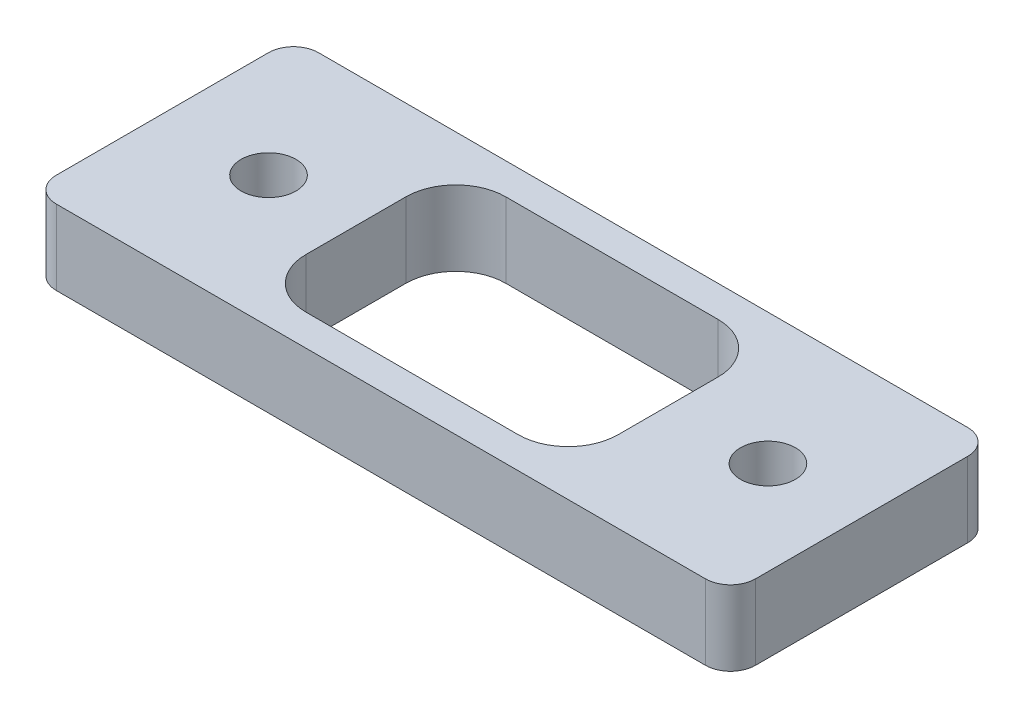
ISO-10303-21;
HEADER;
FILE_DESCRIPTION(('STEP AP214'),'2;1');
FILE_NAME('part.step','',(''),(''),'','','');
FILE_SCHEMA(('AUTOMOTIVE_DESIGN { 1 0 10303 214 1 1 1 1 }'));
ENDSEC;
DATA;
#1=APPLICATION_CONTEXT('core data for automotive mechanical design processes');
#2=APPLICATION_PROTOCOL_DEFINITION('international standard','automotive_design',2000,#1);
#3=PRODUCT_CONTEXT('',#1,'mechanical');
#4=PRODUCT('Part','Part','',(#3));
#5=PRODUCT_RELATED_PRODUCT_CATEGORY('part','',(#4));
#6=PRODUCT_DEFINITION_FORMATION('','',#4);
#7=PRODUCT_DEFINITION_CONTEXT('part definition',#1,'design');
#8=PRODUCT_DEFINITION('design','',#6,#7);
#9=PRODUCT_DEFINITION_SHAPE('','',#8);
#10=(LENGTH_UNIT() NAMED_UNIT(*) SI_UNIT(.MILLI.,.METRE.));
#11=(NAMED_UNIT(*) PLANE_ANGLE_UNIT() SI_UNIT($,.RADIAN.));
#12=(NAMED_UNIT(*) SI_UNIT($,.STERADIAN.) SOLID_ANGLE_UNIT());
#13=UNCERTAINTY_MEASURE_WITH_UNIT(LENGTH_MEASURE(1.E-05),#10,'distance_accuracy_value','');
#14=(GEOMETRIC_REPRESENTATION_CONTEXT(3) GLOBAL_UNCERTAINTY_ASSIGNED_CONTEXT((#13)) GLOBAL_UNIT_ASSIGNED_CONTEXT((#10,
#11,#12)) REPRESENTATION_CONTEXT('',''));
#15=CARTESIAN_POINT('',(0.,0.,0.));
#16=DIRECTION('',(0.,0.,1.));
#17=DIRECTION('',(1.,0.,0.));
#18=AXIS2_PLACEMENT_3D('',#15,#16,#17);
#19=CARTESIAN_POINT('',(-40.,-12.,18.));
#20=DIRECTION('',(0.,1.,0.));
#21=DIRECTION('',(0.,0.,1.));
#22=AXIS2_PLACEMENT_3D('',#19,#20,#21);
#23=PLANE('',#22);
#24=CARTESIAN_POINT('',(8.5,-12.,10.5));
#25=DIRECTION('',(0.,1.,0.));
#26=DIRECTION('',(0.,0.,1.));
#27=AXIS2_PLACEMENT_3D('',#24,#25,#26);
#28=CIRCLE('',#27,2.2);
#29=CARTESIAN_POINT('',(8.5,-12.,12.7));
#30=VERTEX_POINT('',#29);
#31=EDGE_CURVE('E274',#30,#30,#28,.F.);
#32=ORIENTED_EDGE('',*,*,#31,.F.);
#33=EDGE_LOOP('',(#32));
#34=FACE_BOUND('',#33,.T.);
#35=CARTESIAN_POINT('',(48.5,-12.,10.5));
#36=DIRECTION('',(0.,1.,0.));
#37=DIRECTION('',(0.,0.,1.));
#38=AXIS2_PLACEMENT_3D('',#35,#36,#37);
#39=CIRCLE('',#38,2.2);
#40=CARTESIAN_POINT('',(48.5,-12.,12.7));
#41=VERTEX_POINT('',#40);
#42=EDGE_CURVE('E271',#41,#41,#39,.F.);
#43=ORIENTED_EDGE('',*,*,#42,.F.);
#44=EDGE_LOOP('',(#43));
#45=FACE_BOUND('',#44,.T.);
#46=DIRECTION('',(1.,0.,0.));
#47=VECTOR('',#46,1.);
#48=CARTESIAN_POINT('',(-28.,-12.,0.));
#49=LINE('',#48,#47);
#50=CARTESIAN_POINT('',(2.,-12.,0.));
#51=VERTEX_POINT('',#50);
#52=CARTESIAN_POINT('',(54.,-12.,0.));
#53=VERTEX_POINT('',#52);
#54=EDGE_CURVE('E268',#51,#53,#49,.T.);
#55=ORIENTED_EDGE('',*,*,#54,.T.);
#56=CARTESIAN_POINT('',(54.,-12.,2.));
#57=DIRECTION('',(0.,1.,0.));
#58=DIRECTION('',(0.,0.,1.));
#59=AXIS2_PLACEMENT_3D('',#56,#57,#58);
#60=CIRCLE('',#59,2.);
#61=CARTESIAN_POINT('',(56.,-12.,2.00000000000001));
#62=VERTEX_POINT('',#61);
#63=EDGE_CURVE('E179',#53,#62,#60,.F.);
#64=ORIENTED_EDGE('',*,*,#63,.T.);
#65=DIRECTION('',(0.,0.,-1.));
#66=VECTOR('',#65,1.);
#67=CARTESIAN_POINT('',(56.,-12.,21.));
#68=LINE('',#67,#66);
#69=CARTESIAN_POINT('',(56.,-12.,19.));
#70=VERTEX_POINT('',#69);
#71=EDGE_CURVE('E280',#70,#62,#68,.T.);
#72=ORIENTED_EDGE('',*,*,#71,.F.);
#73=CARTESIAN_POINT('',(54.,-12.,19.));
#74=DIRECTION('',(0.,1.,0.));
#75=DIRECTION('',(0.,0.,1.));
#76=AXIS2_PLACEMENT_3D('',#73,#74,#75);
#77=CIRCLE('',#76,2.);
#78=CARTESIAN_POINT('',(54.,-12.,21.));
#79=VERTEX_POINT('',#78);
#80=EDGE_CURVE('E177',#70,#79,#77,.F.);
#81=ORIENTED_EDGE('',*,*,#80,.T.);
#82=DIRECTION('',(1.,0.,0.));
#83=VECTOR('',#82,1.);
#84=CARTESIAN_POINT('',(-28.,-12.,21.));
#85=LINE('',#84,#83);
#86=CARTESIAN_POINT('',(2.,-12.,21.));
#87=VERTEX_POINT('',#86);
#88=EDGE_CURVE('E267',#87,#79,#85,.T.);
#89=ORIENTED_EDGE('',*,*,#88,.F.);
#90=CARTESIAN_POINT('',(2.,-12.,19.));
#91=DIRECTION('',(0.,1.,0.));
#92=DIRECTION('',(0.,0.,1.));
#93=AXIS2_PLACEMENT_3D('',#90,#91,#92);
#94=CIRCLE('',#93,2.);
#95=CARTESIAN_POINT('',(0.,-12.,19.));
#96=VERTEX_POINT('',#95);
#97=EDGE_CURVE('E290',#87,#96,#94,.F.);
#98=ORIENTED_EDGE('',*,*,#97,.T.);
#99=DIRECTION('',(0.,0.,-1.));
#100=VECTOR('',#99,1.);
#101=CARTESIAN_POINT('',(0.,-12.,21.));
#102=LINE('',#101,#100);
#103=CARTESIAN_POINT('',(0.,-12.,2.00000000000001));
#104=VERTEX_POINT('',#103);
#105=EDGE_CURVE('E277',#96,#104,#102,.T.);
#106=ORIENTED_EDGE('',*,*,#105,.T.);
#107=CARTESIAN_POINT('',(2.,-12.,2.));
#108=DIRECTION('',(0.,1.,0.));
#109=DIRECTION('',(0.,0.,1.));
#110=AXIS2_PLACEMENT_3D('',#107,#108,#109);
#111=CIRCLE('',#110,2.);
#112=EDGE_CURVE('E183',#104,#51,#111,.F.);
#113=ORIENTED_EDGE('',*,*,#112,.T.);
#114=EDGE_LOOP('',(#55,#64,#72,#81,#89,#98,#106,#113));
#115=FACE_BOUND('',#114,.T.);
#116=DIRECTION('',(0.,0.,1.));
#117=VECTOR('',#116,1.);
#118=CARTESIAN_POINT('',(40.5,-12.,18.));
#119=LINE('',#118,#117);
#120=CARTESIAN_POINT('',(40.5,-12.,6.50000000000001));
#121=VERTEX_POINT('',#120);
#122=CARTESIAN_POINT('',(40.5,-12.,14.5));
#123=VERTEX_POINT('',#122);
#124=EDGE_CURVE('E164',#121,#123,#119,.T.);
#125=ORIENTED_EDGE('',*,*,#124,.F.);
#126=CARTESIAN_POINT('',(36.5,-12.,6.50000000000001));
#127=DIRECTION('',(0.,1.,0.));
#128=DIRECTION('',(0.,0.,1.));
#129=AXIS2_PLACEMENT_3D('',#126,#127,#128);
#130=CIRCLE('',#129,4.);
#131=CARTESIAN_POINT('',(36.5,-12.,2.50000000000001));
#132=VERTEX_POINT('',#131);
#133=EDGE_CURVE('E223',#121,#132,#130,.T.);
#134=ORIENTED_EDGE('',*,*,#133,.T.);
#135=DIRECTION('',(1.,0.,0.));
#136=VECTOR('',#135,1.);
#137=CARTESIAN_POINT('',(-40.,-12.,2.50000000000002));
#138=LINE('',#137,#136);
#139=CARTESIAN_POINT('',(19.5,-12.,2.50000000000001));
#140=VERTEX_POINT('',#139);
#141=EDGE_CURVE('E234',#140,#132,#138,.T.);
#142=ORIENTED_EDGE('',*,*,#141,.F.);
#143=CARTESIAN_POINT('',(19.5,-12.,6.50000000000001));
#144=DIRECTION('',(0.,1.,0.));
#145=DIRECTION('',(0.,0.,1.));
#146=AXIS2_PLACEMENT_3D('',#143,#144,#145);
#147=CIRCLE('',#146,4.);
#148=CARTESIAN_POINT('',(15.5,-12.,6.50000000000001));
#149=VERTEX_POINT('',#148);
#150=EDGE_CURVE('E216',#140,#149,#147,.T.);
#151=ORIENTED_EDGE('',*,*,#150,.T.);
#152=DIRECTION('',(0.,0.,1.));
#153=VECTOR('',#152,1.);
#154=CARTESIAN_POINT('',(15.5,-12.,18.));
#155=LINE('',#154,#153);
#156=CARTESIAN_POINT('',(15.5,-12.,14.5));
#157=VERTEX_POINT('',#156);
#158=EDGE_CURVE('E247',#149,#157,#155,.T.);
#159=ORIENTED_EDGE('',*,*,#158,.T.);
#160=CARTESIAN_POINT('',(19.5,-12.,14.5));
#161=DIRECTION('',(0.,1.,0.));
#162=DIRECTION('',(0.,0.,1.));
#163=AXIS2_PLACEMENT_3D('',#160,#161,#162);
#164=CIRCLE('',#163,4.);
#165=CARTESIAN_POINT('',(19.5,-12.,18.5));
#166=VERTEX_POINT('',#165);
#167=EDGE_CURVE('E220',#157,#166,#164,.T.);
#168=ORIENTED_EDGE('',*,*,#167,.T.);
#169=DIRECTION('',(1.,0.,0.));
#170=VECTOR('',#169,1.);
#171=CARTESIAN_POINT('',(-40.,-12.,18.5));
#172=LINE('',#171,#170);
#173=CARTESIAN_POINT('',(36.5,-12.,18.5));
#174=VERTEX_POINT('',#173);
#175=EDGE_CURVE('E242',#166,#174,#172,.T.);
#176=ORIENTED_EDGE('',*,*,#175,.T.);
#177=CARTESIAN_POINT('',(36.5,-12.,14.5));
#178=DIRECTION('',(0.,1.,0.));
#179=DIRECTION('',(0.,0.,1.));
#180=AXIS2_PLACEMENT_3D('',#177,#178,#179);
#181=CIRCLE('',#180,4.);
#182=EDGE_CURVE('E11',#174,#123,#181,.T.);
#183=ORIENTED_EDGE('',*,*,#182,.T.);
#184=EDGE_LOOP('',(#125,#134,#142,#151,#159,#168,#176,#183));
#185=FACE_BOUND('',#184,.T.);
#186=ADVANCED_FACE('F40',(#34,#45,#115,#185),#23,.F.);
#187=CARTESIAN_POINT('',(54.,-5.99999999999999,19.));
#188=DIRECTION('',(0.,1.,0.));
#189=DIRECTION('',(-1.,0.,0.));
#190=AXIS2_PLACEMENT_3D('',#187,#188,#189);
#191=PLANE('',#190);
#192=CARTESIAN_POINT('',(54.,-5.99999999999999,19.));
#193=DIRECTION('',(0.,1.,0.));
#194=DIRECTION('',(-1.,0.,0.));
#195=AXIS2_PLACEMENT_3D('',#192,#193,#194);
#196=CIRCLE('',#195,2.);
#197=CARTESIAN_POINT('',(54.,-5.99999999999999,21.));
#198=VERTEX_POINT('',#197);
#199=CARTESIAN_POINT('',(56.,-5.99999999999999,19.));
#200=VERTEX_POINT('',#199);
#201=EDGE_CURVE('E152',#198,#200,#196,.T.);
#202=ORIENTED_EDGE('',*,*,#201,.T.);
#203=DIRECTION('',(0.,0.,-1.));
#204=VECTOR('',#203,1.);
#205=CARTESIAN_POINT('',(56.,-5.99999999999999,19.));
#206=LINE('',#205,#204);
#207=CARTESIAN_POINT('',(56.,-5.99999999999999,2.00000000000001));
#208=VERTEX_POINT('',#207);
#209=EDGE_CURVE('E156',#200,#208,#206,.T.);
#210=ORIENTED_EDGE('',*,*,#209,.T.);
#211=CARTESIAN_POINT('',(54.,-5.99999999999999,2.));
#212=DIRECTION('',(0.,1.,0.));
#213=DIRECTION('',(-1.,0.,0.));
#214=AXIS2_PLACEMENT_3D('',#211,#212,#213);
#215=CIRCLE('',#214,2.);
#216=CARTESIAN_POINT('',(54.,-5.99999999999999,0.));
#217=VERTEX_POINT('',#216);
#218=EDGE_CURVE('E174',#208,#217,#215,.T.);
#219=ORIENTED_EDGE('',*,*,#218,.T.);
#220=DIRECTION('',(-1.,0.,0.));
#221=VECTOR('',#220,1.);
#222=CARTESIAN_POINT('',(54.,-5.99999999999999,0.));
#223=LINE('',#222,#221);
#224=CARTESIAN_POINT('',(2.,-6.,0.));
#225=VERTEX_POINT('',#224);
#226=EDGE_CURVE('E252',#217,#225,#223,.T.);
#227=ORIENTED_EDGE('',*,*,#226,.T.);
#228=CARTESIAN_POINT('',(2.,-6.,2.));
#229=DIRECTION('',(0.,1.,0.));
#230=DIRECTION('',(-1.,0.,0.));
#231=AXIS2_PLACEMENT_3D('',#228,#229,#230);
#232=CIRCLE('',#231,2.);
#233=CARTESIAN_POINT('',(0.,-6.,2.));
#234=VERTEX_POINT('',#233);
#235=EDGE_CURVE('E254',#225,#234,#232,.T.);
#236=ORIENTED_EDGE('',*,*,#235,.T.);
#237=DIRECTION('',(0.,0.,1.));
#238=VECTOR('',#237,1.);
#239=CARTESIAN_POINT('',(0.,-6.,2.00000000000001));
#240=LINE('',#239,#238);
#241=CARTESIAN_POINT('',(0.,-6.,19.));
#242=VERTEX_POINT('',#241);
#243=EDGE_CURVE('E256',#234,#242,#240,.T.);
#244=ORIENTED_EDGE('',*,*,#243,.T.);
#245=CARTESIAN_POINT('',(2.,-6.,19.));
#246=DIRECTION('',(0.,1.,0.));
#247=DIRECTION('',(-1.,0.,0.));
#248=AXIS2_PLACEMENT_3D('',#245,#246,#247);
#249=CIRCLE('',#248,2.);
#250=CARTESIAN_POINT('',(2.,-6.,21.));
#251=VERTEX_POINT('',#250);
#252=EDGE_CURVE('E258',#242,#251,#249,.T.);
#253=ORIENTED_EDGE('',*,*,#252,.T.);
#254=DIRECTION('',(1.,0.,0.));
#255=VECTOR('',#254,1.);
#256=CARTESIAN_POINT('',(2.,-6.,21.));
#257=LINE('',#256,#255);
#258=EDGE_CURVE('E159',#251,#198,#257,.T.);
#259=ORIENTED_EDGE('',*,*,#258,.T.);
#260=EDGE_LOOP('',(#202,#210,#219,#227,#236,#244,#253,#259));
#261=FACE_BOUND('',#260,.T.);
#262=CARTESIAN_POINT('',(48.5,-5.99999999999999,10.5));
#263=DIRECTION('',(0.,1.,0.));
#264=DIRECTION('',(-1.,0.,0.));
#265=AXIS2_PLACEMENT_3D('',#262,#263,#264);
#266=CIRCLE('',#265,2.2);
#267=CARTESIAN_POINT('',(46.3,-5.99999999999999,10.5));
#268=VERTEX_POINT('',#267);
#269=EDGE_CURVE('E261',#268,#268,#266,.F.);
#270=ORIENTED_EDGE('',*,*,#269,.T.);
#271=EDGE_LOOP('',(#270));
#272=FACE_BOUND('',#271,.T.);
#273=CARTESIAN_POINT('',(8.5,-6.,10.5));
#274=DIRECTION('',(0.,1.,0.));
#275=DIRECTION('',(-1.,0.,0.));
#276=AXIS2_PLACEMENT_3D('',#273,#274,#275);
#277=CIRCLE('',#276,2.2);
#278=CARTESIAN_POINT('',(6.3,-6.,10.5));
#279=VERTEX_POINT('',#278);
#280=EDGE_CURVE('E264',#279,#279,#277,.F.);
#281=ORIENTED_EDGE('',*,*,#280,.T.);
#282=EDGE_LOOP('',(#281));
#283=FACE_BOUND('',#282,.T.);
#284=DIRECTION('',(0.,0.,1.));
#285=VECTOR('',#284,1.);
#286=CARTESIAN_POINT('',(15.5,-6.,0.));
#287=LINE('',#286,#285);
#288=CARTESIAN_POINT('',(15.5,-6.,6.50000000000001));
#289=VERTEX_POINT('',#288);
#290=CARTESIAN_POINT('',(15.5,-6.,14.5));
#291=VERTEX_POINT('',#290);
#292=EDGE_CURVE('E235',#289,#291,#287,.T.);
#293=ORIENTED_EDGE('',*,*,#292,.F.);
#294=CARTESIAN_POINT('',(19.5,-6.,6.50000000000001));
#295=DIRECTION('',(0.,1.,0.));
#296=DIRECTION('',(-1.,0.,0.));
#297=AXIS2_PLACEMENT_3D('',#294,#295,#296);
#298=CIRCLE('',#297,4.);
#299=CARTESIAN_POINT('',(19.5,-6.,2.50000000000001));
#300=VERTEX_POINT('',#299);
#301=EDGE_CURVE('E214',#289,#300,#298,.F.);
#302=ORIENTED_EDGE('',*,*,#301,.T.);
#303=DIRECTION('',(1.,0.,0.));
#304=VECTOR('',#303,1.);
#305=CARTESIAN_POINT('',(0.,-6.,2.50000000000001));
#306=LINE('',#305,#304);
#307=CARTESIAN_POINT('',(36.5,-6.,2.50000000000001));
#308=VERTEX_POINT('',#307);
#309=EDGE_CURVE('E506',#300,#308,#306,.T.);
#310=ORIENTED_EDGE('',*,*,#309,.T.);
#311=CARTESIAN_POINT('',(36.5,-5.99999999999999,6.50000000000001));
#312=DIRECTION('',(0.,1.,0.));
#313=DIRECTION('',(-1.,0.,0.));
#314=AXIS2_PLACEMENT_3D('',#311,#312,#313);
#315=CIRCLE('',#314,4.);
#316=CARTESIAN_POINT('',(40.5,-5.99999999999999,6.50000000000001));
#317=VERTEX_POINT('',#316);
#318=EDGE_CURVE('E62',#308,#317,#315,.F.);
#319=ORIENTED_EDGE('',*,*,#318,.T.);
#320=DIRECTION('',(0.,0.,1.));
#321=VECTOR('',#320,1.);
#322=CARTESIAN_POINT('',(40.5,-5.99999999999999,0.));
#323=LINE('',#322,#321);
#324=CARTESIAN_POINT('',(40.5,-5.99999999999999,14.5));
#325=VERTEX_POINT('',#324);
#326=EDGE_CURVE('E228',#317,#325,#323,.T.);
#327=ORIENTED_EDGE('',*,*,#326,.T.);
#328=CARTESIAN_POINT('',(36.5,-5.99999999999999,14.5));
#329=DIRECTION('',(0.,1.,0.));
#330=DIRECTION('',(-1.,0.,0.));
#331=AXIS2_PLACEMENT_3D('',#328,#329,#330);
#332=CIRCLE('',#331,4.);
#333=CARTESIAN_POINT('',(36.5,-6.,18.5));
#334=VERTEX_POINT('',#333);
#335=EDGE_CURVE('E48',#325,#334,#332,.F.);
#336=ORIENTED_EDGE('',*,*,#335,.T.);
#337=DIRECTION('',(1.,0.,0.));
#338=VECTOR('',#337,1.);
#339=CARTESIAN_POINT('',(0.,-6.,18.5));
#340=LINE('',#339,#338);
#341=CARTESIAN_POINT('',(19.5,-6.,18.5));
#342=VERTEX_POINT('',#341);
#343=EDGE_CURVE('E227',#342,#334,#340,.T.);
#344=ORIENTED_EDGE('',*,*,#343,.F.);
#345=CARTESIAN_POINT('',(19.5,-6.,14.5));
#346=DIRECTION('',(0.,1.,0.));
#347=DIRECTION('',(-1.,0.,0.));
#348=AXIS2_PLACEMENT_3D('',#345,#346,#347);
#349=CIRCLE('',#348,4.);
#350=EDGE_CURVE('E218',#342,#291,#349,.F.);
#351=ORIENTED_EDGE('',*,*,#350,.T.);
#352=EDGE_LOOP('',(#293,#302,#310,#319,#327,#336,#344,#351));
#353=FACE_BOUND('',#352,.T.);
#354=ADVANCED_FACE('F154',(#261,#272,#283,#353),#191,.T.);
#355=CARTESIAN_POINT('',(8.50000000000001,-65.,10.5));
#356=DIRECTION('',(0.,1.,0.));
#357=DIRECTION('',(-1.,0.,0.));
#358=AXIS2_PLACEMENT_3D('',#355,#356,#357);
#359=CYLINDRICAL_SURFACE('',#358,2.2);
#360=ORIENTED_EDGE('',*,*,#31,.T.);
#361=EDGE_LOOP('',(#360));
#362=FACE_BOUND('',#361,.T.);
#363=ORIENTED_EDGE('',*,*,#280,.F.);
#364=EDGE_LOOP('',(#363));
#365=FACE_BOUND('',#364,.T.);
#366=ADVANCED_FACE('F334',(#362,#365),#359,.F.);
#367=CARTESIAN_POINT('',(48.5,-65.,10.5));
#368=DIRECTION('',(0.,1.,0.));
#369=DIRECTION('',(-1.,0.,0.));
#370=AXIS2_PLACEMENT_3D('',#367,#368,#369);
#371=CYLINDRICAL_SURFACE('',#370,2.2);
#372=ORIENTED_EDGE('',*,*,#42,.T.);
#373=EDGE_LOOP('',(#372));
#374=FACE_BOUND('',#373,.T.);
#375=ORIENTED_EDGE('',*,*,#269,.F.);
#376=EDGE_LOOP('',(#375));
#377=FACE_BOUND('',#376,.T.);
#378=ADVANCED_FACE('F340',(#374,#377),#371,.F.);
#379=CARTESIAN_POINT('',(56.,0.,21.));
#380=DIRECTION('',(1.,0.,0.));
#381=DIRECTION('',(0.,0.,-1.));
#382=AXIS2_PLACEMENT_3D('',#379,#380,#381);
#383=PLANE('',#382);
#384=DIRECTION('',(0.,-1.,0.));
#385=VECTOR('',#384,1.);
#386=CARTESIAN_POINT('',(56.,0.,2.));
#387=LINE('',#386,#385);
#388=EDGE_CURVE('E173',#62,#208,#387,.F.);
#389=ORIENTED_EDGE('',*,*,#388,.T.);
#390=ORIENTED_EDGE('',*,*,#209,.F.);
#391=DIRECTION('',(0.,-1.,0.));
#392=VECTOR('',#391,1.);
#393=CARTESIAN_POINT('',(56.,0.,19.));
#394=LINE('',#393,#392);
#395=EDGE_CURVE('E170',#200,#70,#394,.T.);
#396=ORIENTED_EDGE('',*,*,#395,.T.);
#397=ORIENTED_EDGE('',*,*,#71,.T.);
#398=EDGE_LOOP('',(#389,#390,#396,#397));
#399=FACE_BOUND('',#398,.T.);
#400=ADVANCED_FACE('F168',(#399),#383,.T.);
#401=CARTESIAN_POINT('',(0.,0.,21.));
#402=DIRECTION('',(1.,0.,0.));
#403=DIRECTION('',(0.,0.,-1.));
#404=AXIS2_PLACEMENT_3D('',#401,#402,#403);
#405=PLANE('',#404);
#406=ORIENTED_EDGE('',*,*,#243,.F.);
#407=DIRECTION('',(0.,-1.,0.));
#408=VECTOR('',#407,1.);
#409=CARTESIAN_POINT('',(0.,0.,2.));
#410=LINE('',#409,#408);
#411=EDGE_CURVE('E189',#234,#104,#410,.T.);
#412=ORIENTED_EDGE('',*,*,#411,.T.);
#413=ORIENTED_EDGE('',*,*,#105,.F.);
#414=DIRECTION('',(0.,-1.,0.));
#415=VECTOR('',#414,1.);
#416=CARTESIAN_POINT('',(0.,0.,19.));
#417=LINE('',#416,#415);
#418=EDGE_CURVE('E181',#96,#242,#417,.F.);
#419=ORIENTED_EDGE('',*,*,#418,.T.);
#420=EDGE_LOOP('',(#406,#412,#413,#419));
#421=FACE_BOUND('',#420,.T.);
#422=ADVANCED_FACE('F308',(#421),#405,.F.);
#423=CARTESIAN_POINT('',(0.,0.,21.));
#424=DIRECTION('',(0.,0.,1.));
#425=DIRECTION('',(1.,0.,0.));
#426=AXIS2_PLACEMENT_3D('',#423,#424,#425);
#427=PLANE('',#426);
#428=DIRECTION('',(0.,-1.,0.));
#429=VECTOR('',#428,1.);
#430=CARTESIAN_POINT('',(54.,0.,21.));
#431=LINE('',#430,#429);
#432=EDGE_CURVE('E191',#79,#198,#431,.F.);
#433=ORIENTED_EDGE('',*,*,#432,.T.);
#434=ORIENTED_EDGE('',*,*,#258,.F.);
#435=DIRECTION('',(0.,-1.,0.));
#436=VECTOR('',#435,1.);
#437=CARTESIAN_POINT('',(2.,-12.,21.));
#438=LINE('',#437,#436);
#439=EDGE_CURVE('E193',#251,#87,#438,.T.);
#440=ORIENTED_EDGE('',*,*,#439,.T.);
#441=ORIENTED_EDGE('',*,*,#88,.T.);
#442=EDGE_LOOP('',(#433,#434,#440,#441));
#443=FACE_BOUND('',#442,.T.);
#444=ADVANCED_FACE('F316',(#443),#427,.T.);
#445=CARTESIAN_POINT('',(0.,0.,0.));
#446=DIRECTION('',(0.,0.,1.));
#447=DIRECTION('',(1.,0.,0.));
#448=AXIS2_PLACEMENT_3D('',#445,#446,#447);
#449=PLANE('',#448);
#450=ORIENTED_EDGE('',*,*,#226,.F.);
#451=DIRECTION('',(0.,-1.,0.));
#452=VECTOR('',#451,1.);
#453=CARTESIAN_POINT('',(54.,-12.,0.));
#454=LINE('',#453,#452);
#455=EDGE_CURVE('E287',#217,#53,#454,.T.);
#456=ORIENTED_EDGE('',*,*,#455,.T.);
#457=ORIENTED_EDGE('',*,*,#54,.F.);
#458=DIRECTION('',(0.,-1.,0.));
#459=VECTOR('',#458,1.);
#460=CARTESIAN_POINT('',(2.,0.,0.));
#461=LINE('',#460,#459);
#462=EDGE_CURVE('E282',#51,#225,#461,.F.);
#463=ORIENTED_EDGE('',*,*,#462,.T.);
#464=EDGE_LOOP('',(#450,#456,#457,#463));
#465=FACE_BOUND('',#464,.T.);
#466=ADVANCED_FACE('F300',(#465),#449,.F.);
#467=CARTESIAN_POINT('',(54.,0.,2.));
#468=DIRECTION('',(0.,1.,0.));
#469=DIRECTION('',(0.,0.,1.));
#470=AXIS2_PLACEMENT_3D('',#467,#468,#469);
#471=CYLINDRICAL_SURFACE('',#470,2.);
#472=ORIENTED_EDGE('',*,*,#455,.F.);
#473=ORIENTED_EDGE('',*,*,#218,.F.);
#474=ORIENTED_EDGE('',*,*,#388,.F.);
#475=ORIENTED_EDGE('',*,*,#63,.F.);
#476=EDGE_LOOP('',(#472,#473,#474,#475));
#477=FACE_BOUND('',#476,.T.);
#478=ADVANCED_FACE('F318',(#477),#471,.T.);
#479=CARTESIAN_POINT('',(2.,0.,2.));
#480=DIRECTION('',(0.,-1.,0.));
#481=DIRECTION('',(0.,0.,-1.));
#482=AXIS2_PLACEMENT_3D('',#479,#480,#481);
#483=CYLINDRICAL_SURFACE('',#482,2.);
#484=ORIENTED_EDGE('',*,*,#411,.F.);
#485=ORIENTED_EDGE('',*,*,#235,.F.);
#486=ORIENTED_EDGE('',*,*,#462,.F.);
#487=ORIENTED_EDGE('',*,*,#112,.F.);
#488=EDGE_LOOP('',(#484,#485,#486,#487));
#489=FACE_BOUND('',#488,.T.);
#490=ADVANCED_FACE('F304',(#489),#483,.T.);
#491=CARTESIAN_POINT('',(2.,0.,19.));
#492=DIRECTION('',(0.,1.,0.));
#493=DIRECTION('',(0.,0.,1.));
#494=AXIS2_PLACEMENT_3D('',#491,#492,#493);
#495=CYLINDRICAL_SURFACE('',#494,2.);
#496=ORIENTED_EDGE('',*,*,#439,.F.);
#497=ORIENTED_EDGE('',*,*,#252,.F.);
#498=ORIENTED_EDGE('',*,*,#418,.F.);
#499=ORIENTED_EDGE('',*,*,#97,.F.);
#500=EDGE_LOOP('',(#496,#497,#498,#499));
#501=FACE_BOUND('',#500,.T.);
#502=ADVANCED_FACE('F313',(#501),#495,.T.);
#503=CARTESIAN_POINT('',(54.,0.,19.));
#504=DIRECTION('',(0.,-1.,0.));
#505=DIRECTION('',(0.,0.,-1.));
#506=AXIS2_PLACEMENT_3D('',#503,#504,#505);
#507=CYLINDRICAL_SURFACE('',#506,2.);
#508=ORIENTED_EDGE('',*,*,#395,.F.);
#509=ORIENTED_EDGE('',*,*,#201,.F.);
#510=ORIENTED_EDGE('',*,*,#432,.F.);
#511=ORIENTED_EDGE('',*,*,#80,.F.);
#512=EDGE_LOOP('',(#508,#509,#510,#511));
#513=FACE_BOUND('',#512,.T.);
#514=ADVANCED_FACE('F176',(#513),#507,.T.);
#515=CARTESIAN_POINT('',(40.5,-61.,0.));
#516=DIRECTION('',(-1.,0.,0.));
#517=DIRECTION('',(0.,-1.,0.));
#518=AXIS2_PLACEMENT_3D('',#515,#516,#517);
#519=PLANE('',#518);
#520=ORIENTED_EDGE('',*,*,#326,.F.);
#521=DIRECTION('',(0.,1.,0.));
#522=VECTOR('',#521,1.);
#523=CARTESIAN_POINT('',(40.5,-12.,6.50000000000001));
#524=LINE('',#523,#522);
#525=EDGE_CURVE('E212',#317,#121,#524,.F.);
#526=ORIENTED_EDGE('',*,*,#525,.T.);
#527=ORIENTED_EDGE('',*,*,#124,.T.);
#528=DIRECTION('',(0.,1.,0.));
#529=VECTOR('',#528,1.);
#530=CARTESIAN_POINT('',(40.5,-61.,14.5));
#531=LINE('',#530,#529);
#532=EDGE_CURVE('E210',#123,#325,#531,.T.);
#533=ORIENTED_EDGE('',*,*,#532,.T.);
#534=EDGE_LOOP('',(#520,#526,#527,#533));
#535=FACE_BOUND('',#534,.T.);
#536=ADVANCED_FACE('F244',(#535),#519,.T.);
#537=CARTESIAN_POINT('',(0.,-61.,18.5));
#538=DIRECTION('',(0.,0.,1.));
#539=DIRECTION('',(1.,0.,0.));
#540=AXIS2_PLACEMENT_3D('',#537,#538,#539);
#541=PLANE('',#540);
#542=ORIENTED_EDGE('',*,*,#175,.F.);
#543=DIRECTION('',(0.,1.,0.));
#544=VECTOR('',#543,1.);
#545=CARTESIAN_POINT('',(19.5,-6.,18.5));
#546=LINE('',#545,#544);
#547=EDGE_CURVE('E207',#166,#342,#546,.T.);
#548=ORIENTED_EDGE('',*,*,#547,.T.);
#549=ORIENTED_EDGE('',*,*,#343,.T.);
#550=DIRECTION('',(0.,1.,0.));
#551=VECTOR('',#550,1.);
#552=CARTESIAN_POINT('',(36.5,-61.,18.5));
#553=LINE('',#552,#551);
#554=EDGE_CURVE('E205',#334,#174,#553,.F.);
#555=ORIENTED_EDGE('',*,*,#554,.T.);
#556=EDGE_LOOP('',(#542,#548,#549,#555));
#557=FACE_BOUND('',#556,.T.);
#558=ADVANCED_FACE('F231',(#557),#541,.F.);
#559=CARTESIAN_POINT('',(15.5,-61.,0.));
#560=DIRECTION('',(-1.,0.,0.));
#561=DIRECTION('',(0.,-1.,0.));
#562=AXIS2_PLACEMENT_3D('',#559,#560,#561);
#563=PLANE('',#562);
#564=ORIENTED_EDGE('',*,*,#158,.F.);
#565=DIRECTION('',(0.,1.,0.));
#566=VECTOR('',#565,1.);
#567=CARTESIAN_POINT('',(15.5,-61.,6.50000000000001));
#568=LINE('',#567,#566);
#569=EDGE_CURVE('E197',#149,#289,#568,.T.);
#570=ORIENTED_EDGE('',*,*,#569,.T.);
#571=ORIENTED_EDGE('',*,*,#292,.T.);
#572=DIRECTION('',(0.,1.,0.));
#573=VECTOR('',#572,1.);
#574=CARTESIAN_POINT('',(15.5,-12.,14.5));
#575=LINE('',#574,#573);
#576=EDGE_CURVE('E195',#291,#157,#575,.F.);
#577=ORIENTED_EDGE('',*,*,#576,.T.);
#578=EDGE_LOOP('',(#564,#570,#571,#577));
#579=FACE_BOUND('',#578,.T.);
#580=ADVANCED_FACE('F421',(#579),#563,.F.);
#581=CARTESIAN_POINT('',(0.,-61.,2.50000000000001));
#582=DIRECTION('',(0.,0.,1.));
#583=DIRECTION('',(1.,0.,0.));
#584=AXIS2_PLACEMENT_3D('',#581,#582,#583);
#585=PLANE('',#584);
#586=ORIENTED_EDGE('',*,*,#309,.F.);
#587=DIRECTION('',(0.,1.,0.));
#588=VECTOR('',#587,1.);
#589=CARTESIAN_POINT('',(19.5,-61.,2.50000000000001));
#590=LINE('',#589,#588);
#591=EDGE_CURVE('E203',#300,#140,#590,.F.);
#592=ORIENTED_EDGE('',*,*,#591,.T.);
#593=ORIENTED_EDGE('',*,*,#141,.T.);
#594=DIRECTION('',(0.,1.,0.));
#595=VECTOR('',#594,1.);
#596=CARTESIAN_POINT('',(36.5,-6.,2.50000000000001));
#597=LINE('',#596,#595);
#598=EDGE_CURVE('E200',#132,#308,#597,.T.);
#599=ORIENTED_EDGE('',*,*,#598,.T.);
#600=EDGE_LOOP('',(#586,#592,#593,#599));
#601=FACE_BOUND('',#600,.T.);
#602=ADVANCED_FACE('F431',(#601),#585,.T.);
#603=CARTESIAN_POINT('',(19.5,-61.,6.50000000000001));
#604=DIRECTION('',(0.,1.,0.));
#605=DIRECTION('',(-1.,0.,0.));
#606=AXIS2_PLACEMENT_3D('',#603,#604,#605);
#607=CYLINDRICAL_SURFACE('',#606,4.);
#608=ORIENTED_EDGE('',*,*,#150,.F.);
#609=ORIENTED_EDGE('',*,*,#591,.F.);
#610=ORIENTED_EDGE('',*,*,#301,.F.);
#611=ORIENTED_EDGE('',*,*,#569,.F.);
#612=EDGE_LOOP('',(#608,#609,#610,#611));
#613=FACE_BOUND('',#612,.T.);
#614=ADVANCED_FACE('F442',(#613),#607,.F.);
#615=CARTESIAN_POINT('',(19.5,-61.,14.5));
#616=DIRECTION('',(0.,-1.,0.));
#617=DIRECTION('',(1.,0.,0.));
#618=AXIS2_PLACEMENT_3D('',#615,#616,#617);
#619=CYLINDRICAL_SURFACE('',#618,4.);
#620=ORIENTED_EDGE('',*,*,#167,.F.);
#621=ORIENTED_EDGE('',*,*,#576,.F.);
#622=ORIENTED_EDGE('',*,*,#350,.F.);
#623=ORIENTED_EDGE('',*,*,#547,.F.);
#624=EDGE_LOOP('',(#620,#621,#622,#623));
#625=FACE_BOUND('',#624,.T.);
#626=ADVANCED_FACE('F453',(#625),#619,.F.);
#627=CARTESIAN_POINT('',(36.5,-61.,6.50000000000001));
#628=DIRECTION('',(0.,-1.,0.));
#629=DIRECTION('',(1.,0.,0.));
#630=AXIS2_PLACEMENT_3D('',#627,#628,#629);
#631=CYLINDRICAL_SURFACE('',#630,4.);
#632=ORIENTED_EDGE('',*,*,#133,.F.);
#633=ORIENTED_EDGE('',*,*,#525,.F.);
#634=ORIENTED_EDGE('',*,*,#318,.F.);
#635=ORIENTED_EDGE('',*,*,#598,.F.);
#636=EDGE_LOOP('',(#632,#633,#634,#635));
#637=FACE_BOUND('',#636,.T.);
#638=ADVANCED_FACE('F464',(#637),#631,.F.);
#639=CARTESIAN_POINT('',(36.5,-61.,14.5));
#640=DIRECTION('',(0.,1.,0.));
#641=DIRECTION('',(-1.,0.,0.));
#642=AXIS2_PLACEMENT_3D('',#639,#640,#641);
#643=CYLINDRICAL_SURFACE('',#642,4.);
#644=ORIENTED_EDGE('',*,*,#182,.F.);
#645=ORIENTED_EDGE('',*,*,#554,.F.);
#646=ORIENTED_EDGE('',*,*,#335,.F.);
#647=ORIENTED_EDGE('',*,*,#532,.F.);
#648=EDGE_LOOP('',(#644,#645,#646,#647));
#649=FACE_BOUND('',#648,.T.);
#650=ADVANCED_FACE('F42',(#649),#643,.F.);
#651=CLOSED_SHELL('',(#186,#354,#366,#378,#400,#422,#444,#466,#478,#490,#502,#514,#536,#558,
#580,#602,#614,#626,#638,#650));
#652=MANIFOLD_SOLID_BREP('B2',#651);
#653=ADVANCED_BREP_SHAPE_REPRESENTATION('',(#18,#652),#14);
#654=SHAPE_DEFINITION_REPRESENTATION(#9,#653);
ENDSEC;
END-ISO-10303-21;
